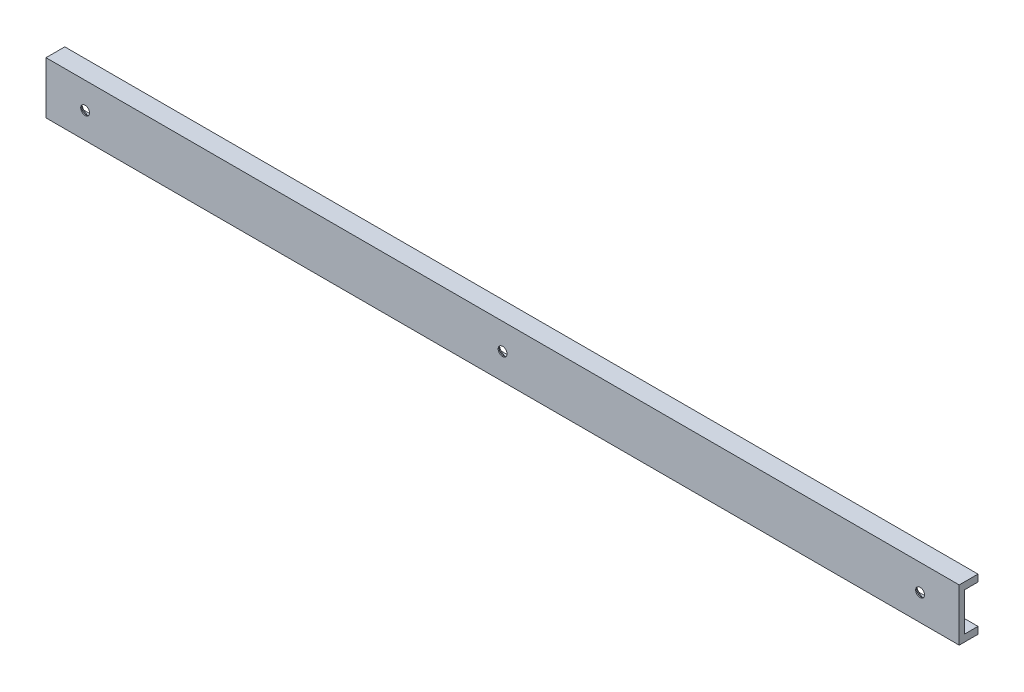
ISO-10303-21;
HEADER;
FILE_DESCRIPTION(('STEP AP214'),'2;1');
FILE_NAME('part.step','',(''),(''),'','','');
FILE_SCHEMA(('AUTOMOTIVE_DESIGN { 1 0 10303 214 1 1 1 1 }'));
ENDSEC;
DATA;
#1=APPLICATION_CONTEXT('core data for automotive mechanical design processes');
#2=APPLICATION_PROTOCOL_DEFINITION('international standard','automotive_design',2000,#1);
#3=PRODUCT_CONTEXT('',#1,'mechanical');
#4=PRODUCT('Part','Part','',(#3));
#5=PRODUCT_RELATED_PRODUCT_CATEGORY('part','',(#4));
#6=PRODUCT_DEFINITION_FORMATION('','',#4);
#7=PRODUCT_DEFINITION_CONTEXT('part definition',#1,'design');
#8=PRODUCT_DEFINITION('design','',#6,#7);
#9=PRODUCT_DEFINITION_SHAPE('','',#8);
#10=(LENGTH_UNIT() NAMED_UNIT(*) SI_UNIT(.MILLI.,.METRE.));
#11=(NAMED_UNIT(*) PLANE_ANGLE_UNIT() SI_UNIT($,.RADIAN.));
#12=(NAMED_UNIT(*) SI_UNIT($,.STERADIAN.) SOLID_ANGLE_UNIT());
#13=UNCERTAINTY_MEASURE_WITH_UNIT(LENGTH_MEASURE(1.E-05),#10,'distance_accuracy_value','');
#14=(GEOMETRIC_REPRESENTATION_CONTEXT(3) GLOBAL_UNCERTAINTY_ASSIGNED_CONTEXT((#13)) GLOBAL_UNIT_ASSIGNED_CONTEXT((#10,
#11,#12)) REPRESENTATION_CONTEXT('',''));
#15=CARTESIAN_POINT('',(0.,0.,0.));
#16=DIRECTION('',(0.,0.,1.));
#17=DIRECTION('',(1.,0.,0.));
#18=AXIS2_PLACEMENT_3D('',#15,#16,#17);
#19=CARTESIAN_POINT('',(-160.,0.,-2.));
#20=DIRECTION('',(0.,0.,-1.));
#21=DIRECTION('',(-1.,0.,0.));
#22=AXIS2_PLACEMENT_3D('',#19,#20,#21);
#23=CONICAL_SURFACE('',#22,3.3,0.785398163397445);
#24=CARTESIAN_POINT('',(-160.,0.,-0.400000000000001));
#25=DIRECTION('',(0.,0.,-1.));
#26=DIRECTION('',(-1.,0.,0.));
#27=AXIS2_PLACEMENT_3D('',#24,#25,#26);
#28=CIRCLE('',#27,1.70000000000001);
#29=CARTESIAN_POINT('',(-161.7,0.,-0.400000000000001));
#30=VERTEX_POINT('',#29);
#31=EDGE_CURVE('E11',#30,#30,#28,.T.);
#32=ORIENTED_EDGE('',*,*,#31,.F.);
#33=EDGE_LOOP('',(#32));
#34=FACE_BOUND('',#33,.T.);
#35=CARTESIAN_POINT('',(-160.,0.,-2.));
#36=DIRECTION('',(0.,0.,-1.));
#37=DIRECTION('',(-1.,0.,0.));
#38=AXIS2_PLACEMENT_3D('',#35,#36,#37);
#39=CIRCLE('',#38,3.3);
#40=CARTESIAN_POINT('',(-163.3,0.,-2.));
#41=VERTEX_POINT('',#40);
#42=EDGE_CURVE('E163',#41,#41,#39,.T.);
#43=ORIENTED_EDGE('',*,*,#42,.T.);
#44=EDGE_LOOP('',(#43));
#45=FACE_BOUND('',#44,.T.);
#46=ADVANCED_FACE('F35',(#34,#45),#23,.F.);
#47=CARTESIAN_POINT('',(-160.,0.,-2.));
#48=DIRECTION('',(0.,0.,-1.));
#49=DIRECTION('',(-1.,0.,0.));
#50=AXIS2_PLACEMENT_3D('',#47,#48,#49);
#51=CYLINDRICAL_SURFACE('',#50,1.70000000000001);
#52=CARTESIAN_POINT('',(-160.,0.,0.));
#53=DIRECTION('',(0.,0.,-1.));
#54=DIRECTION('',(-1.,0.,0.));
#55=AXIS2_PLACEMENT_3D('',#52,#53,#54);
#56=CIRCLE('',#55,1.70000000000001);
#57=CARTESIAN_POINT('',(-161.7,0.,0.));
#58=VERTEX_POINT('',#57);
#59=EDGE_CURVE('E43',#58,#58,#56,.T.);
#60=ORIENTED_EDGE('',*,*,#59,.F.);
#61=EDGE_LOOP('',(#60));
#62=FACE_BOUND('',#61,.T.);
#63=ORIENTED_EDGE('',*,*,#31,.T.);
#64=EDGE_LOOP('',(#63));
#65=FACE_BOUND('',#64,.T.);
#66=ADVANCED_FACE('F170',(#62,#65),#51,.F.);
#67=CARTESIAN_POINT('',(175.,10.,0.));
#68=DIRECTION('',(0.,-1.,0.));
#69=DIRECTION('',(0.,0.,-1.));
#70=AXIS2_PLACEMENT_3D('',#67,#68,#69);
#71=PLANE('',#70);
#72=DIRECTION('',(0.,0.,1.));
#73=VECTOR('',#72,1.);
#74=CARTESIAN_POINT('',(-175.,10.,0.));
#75=LINE('',#74,#73);
#76=CARTESIAN_POINT('',(-175.,10.,-7.2));
#77=VERTEX_POINT('',#76);
#78=CARTESIAN_POINT('',(-175.,10.,0.));
#79=VERTEX_POINT('',#78);
#80=EDGE_CURVE('E133',#77,#79,#75,.T.);
#81=ORIENTED_EDGE('',*,*,#80,.T.);
#82=DIRECTION('',(-1.,0.,0.));
#83=VECTOR('',#82,1.);
#84=CARTESIAN_POINT('',(175.,10.,0.));
#85=LINE('',#84,#83);
#86=CARTESIAN_POINT('',(175.,10.,0.));
#87=VERTEX_POINT('',#86);
#88=EDGE_CURVE('E161',#87,#79,#85,.T.);
#89=ORIENTED_EDGE('',*,*,#88,.F.);
#90=DIRECTION('',(0.,0.,1.));
#91=VECTOR('',#90,1.);
#92=CARTESIAN_POINT('',(175.,10.,0.));
#93=LINE('',#92,#91);
#94=CARTESIAN_POINT('',(175.,10.,-7.2));
#95=VERTEX_POINT('',#94);
#96=EDGE_CURVE('E148',#95,#87,#93,.T.);
#97=ORIENTED_EDGE('',*,*,#96,.F.);
#98=DIRECTION('',(-1.,0.,0.));
#99=VECTOR('',#98,1.);
#100=CARTESIAN_POINT('',(175.,10.,-7.2));
#101=LINE('',#100,#99);
#102=EDGE_CURVE('E129',#95,#77,#101,.T.);
#103=ORIENTED_EDGE('',*,*,#102,.T.);
#104=EDGE_LOOP('',(#81,#89,#97,#103));
#105=FACE_BOUND('',#104,.T.);
#106=ADVANCED_FACE('F173',(#105),#71,.F.);
#107=CARTESIAN_POINT('',(175.,-10.,0.));
#108=DIRECTION('',(0.,0.,-1.));
#109=DIRECTION('',(-1.,0.,0.));
#110=AXIS2_PLACEMENT_3D('',#107,#108,#109);
#111=PLANE('',#110);
#112=CARTESIAN_POINT('',(0.,0.,0.));
#113=DIRECTION('',(0.,0.,-1.));
#114=DIRECTION('',(-1.,0.,0.));
#115=AXIS2_PLACEMENT_3D('',#112,#113,#114);
#116=CIRCLE('',#115,1.70000000000001);
#117=CARTESIAN_POINT('',(-1.70000000000003,0.,0.));
#118=VERTEX_POINT('',#117);
#119=EDGE_CURVE('E238',#118,#118,#116,.T.);
#120=ORIENTED_EDGE('',*,*,#119,.T.);
#121=EDGE_LOOP('',(#120));
#122=FACE_BOUND('',#121,.T.);
#123=CARTESIAN_POINT('',(160.,0.,0.));
#124=DIRECTION('',(0.,0.,-1.));
#125=DIRECTION('',(-1.,0.,0.));
#126=AXIS2_PLACEMENT_3D('',#123,#124,#125);
#127=CIRCLE('',#126,1.70000000000001);
#128=CARTESIAN_POINT('',(158.3,0.,0.));
#129=VERTEX_POINT('',#128);
#130=EDGE_CURVE('E137',#129,#129,#127,.T.);
#131=ORIENTED_EDGE('',*,*,#130,.T.);
#132=EDGE_LOOP('',(#131));
#133=FACE_BOUND('',#132,.T.);
#134=DIRECTION('',(0.,-1.,0.));
#135=VECTOR('',#134,1.);
#136=CARTESIAN_POINT('',(-175.,-10.,0.));
#137=LINE('',#136,#135);
#138=CARTESIAN_POINT('',(-175.,-10.,0.));
#139=VERTEX_POINT('',#138);
#140=EDGE_CURVE('E136',#79,#139,#137,.T.);
#141=ORIENTED_EDGE('',*,*,#140,.T.);
#142=DIRECTION('',(-1.,0.,0.));
#143=VECTOR('',#142,1.);
#144=CARTESIAN_POINT('',(175.,-10.,0.));
#145=LINE('',#144,#143);
#146=CARTESIAN_POINT('',(175.,-10.,0.));
#147=VERTEX_POINT('',#146);
#148=EDGE_CURVE('E158',#147,#139,#145,.T.);
#149=ORIENTED_EDGE('',*,*,#148,.F.);
#150=DIRECTION('',(0.,-1.,0.));
#151=VECTOR('',#150,1.);
#152=CARTESIAN_POINT('',(175.,-10.,0.));
#153=LINE('',#152,#151);
#154=EDGE_CURVE('E95',#87,#147,#153,.T.);
#155=ORIENTED_EDGE('',*,*,#154,.F.);
#156=ORIENTED_EDGE('',*,*,#88,.T.);
#157=EDGE_LOOP('',(#141,#149,#155,#156));
#158=FACE_BOUND('',#157,.T.);
#159=ORIENTED_EDGE('',*,*,#59,.T.);
#160=EDGE_LOOP('',(#159));
#161=FACE_BOUND('',#160,.T.);
#162=ADVANCED_FACE('F168',(#122,#133,#158,#161),#111,.F.);
#163=CARTESIAN_POINT('',(175.,-10.,-7.2));
#164=DIRECTION('',(0.,1.,0.));
#165=DIRECTION('',(0.,0.,1.));
#166=AXIS2_PLACEMENT_3D('',#163,#164,#165);
#167=PLANE('',#166);
#168=DIRECTION('',(0.,0.,-1.));
#169=VECTOR('',#168,1.);
#170=CARTESIAN_POINT('',(-175.,-10.,-7.2));
#171=LINE('',#170,#169);
#172=CARTESIAN_POINT('',(-175.,-10.,-7.2));
#173=VERTEX_POINT('',#172);
#174=EDGE_CURVE('E139',#139,#173,#171,.T.);
#175=ORIENTED_EDGE('',*,*,#174,.T.);
#176=DIRECTION('',(-1.,0.,0.));
#177=VECTOR('',#176,1.);
#178=CARTESIAN_POINT('',(175.,-10.,-7.2));
#179=LINE('',#178,#177);
#180=CARTESIAN_POINT('',(175.,-10.,-7.2));
#181=VERTEX_POINT('',#180);
#182=EDGE_CURVE('E155',#181,#173,#179,.T.);
#183=ORIENTED_EDGE('',*,*,#182,.F.);
#184=DIRECTION('',(0.,0.,-1.));
#185=VECTOR('',#184,1.);
#186=CARTESIAN_POINT('',(175.,-10.,-7.2));
#187=LINE('',#186,#185);
#188=EDGE_CURVE('E219',#147,#181,#187,.T.);
#189=ORIENTED_EDGE('',*,*,#188,.F.);
#190=ORIENTED_EDGE('',*,*,#148,.T.);
#191=EDGE_LOOP('',(#175,#183,#189,#190));
#192=FACE_BOUND('',#191,.T.);
#193=ADVANCED_FACE('F198',(#192),#167,.F.);
#194=CARTESIAN_POINT('',(175.,-7.35,-7.2));
#195=DIRECTION('',(0.,0.,1.));
#196=DIRECTION('',(1.,0.,0.));
#197=AXIS2_PLACEMENT_3D('',#194,#195,#196);
#198=PLANE('',#197);
#199=DIRECTION('',(0.,1.,0.));
#200=VECTOR('',#199,1.);
#201=CARTESIAN_POINT('',(-175.,-7.35,-7.2));
#202=LINE('',#201,#200);
#203=CARTESIAN_POINT('',(-175.,-7.35,-7.2));
#204=VERTEX_POINT('',#203);
#205=EDGE_CURVE('E141',#173,#204,#202,.T.);
#206=ORIENTED_EDGE('',*,*,#205,.T.);
#207=DIRECTION('',(-1.,0.,0.));
#208=VECTOR('',#207,1.);
#209=CARTESIAN_POINT('',(175.,-7.35,-7.2));
#210=LINE('',#209,#208);
#211=CARTESIAN_POINT('',(175.,-7.35,-7.2));
#212=VERTEX_POINT('',#211);
#213=EDGE_CURVE('E152',#212,#204,#210,.T.);
#214=ORIENTED_EDGE('',*,*,#213,.F.);
#215=DIRECTION('',(0.,1.,0.));
#216=VECTOR('',#215,1.);
#217=CARTESIAN_POINT('',(175.,-7.35,-7.2));
#218=LINE('',#217,#216);
#219=EDGE_CURVE('E221',#181,#212,#218,.T.);
#220=ORIENTED_EDGE('',*,*,#219,.F.);
#221=ORIENTED_EDGE('',*,*,#182,.T.);
#222=EDGE_LOOP('',(#206,#214,#220,#221));
#223=FACE_BOUND('',#222,.T.);
#224=ADVANCED_FACE('F189',(#223),#198,.F.);
#225=CARTESIAN_POINT('',(175.,-7.35,-2.));
#226=DIRECTION('',(0.,-1.,0.));
#227=DIRECTION('',(0.,0.,-1.));
#228=AXIS2_PLACEMENT_3D('',#225,#226,#227);
#229=PLANE('',#228);
#230=DIRECTION('',(0.,0.,1.));
#231=VECTOR('',#230,1.);
#232=CARTESIAN_POINT('',(-175.,-7.35,-2.));
#233=LINE('',#232,#231);
#234=CARTESIAN_POINT('',(-175.,-7.35,-2.));
#235=VERTEX_POINT('',#234);
#236=EDGE_CURVE('E143',#204,#235,#233,.T.);
#237=ORIENTED_EDGE('',*,*,#236,.T.);
#238=DIRECTION('',(-1.,0.,0.));
#239=VECTOR('',#238,1.);
#240=CARTESIAN_POINT('',(175.,-7.35,-2.));
#241=LINE('',#240,#239);
#242=CARTESIAN_POINT('',(175.,-7.35,-2.));
#243=VERTEX_POINT('',#242);
#244=EDGE_CURVE('E124',#243,#235,#241,.T.);
#245=ORIENTED_EDGE('',*,*,#244,.F.);
#246=DIRECTION('',(0.,0.,1.));
#247=VECTOR('',#246,1.);
#248=CARTESIAN_POINT('',(175.,-7.35,-2.));
#249=LINE('',#248,#247);
#250=EDGE_CURVE('E114',#212,#243,#249,.T.);
#251=ORIENTED_EDGE('',*,*,#250,.F.);
#252=ORIENTED_EDGE('',*,*,#213,.T.);
#253=EDGE_LOOP('',(#237,#245,#251,#252));
#254=FACE_BOUND('',#253,.T.);
#255=ADVANCED_FACE('F180',(#254),#229,.F.);
#256=CARTESIAN_POINT('',(175.,7.35,-2.));
#257=DIRECTION('',(0.,0.,1.));
#258=DIRECTION('',(1.,0.,0.));
#259=AXIS2_PLACEMENT_3D('',#256,#257,#258);
#260=PLANE('',#259);
#261=CARTESIAN_POINT('',(0.,0.,-2.));
#262=DIRECTION('',(0.,0.,-1.));
#263=DIRECTION('',(-1.,0.,0.));
#264=AXIS2_PLACEMENT_3D('',#261,#262,#263);
#265=CIRCLE('',#264,3.3);
#266=CARTESIAN_POINT('',(-3.30000000000003,0.,-2.));
#267=VERTEX_POINT('',#266);
#268=EDGE_CURVE('E241',#267,#267,#265,.T.);
#269=ORIENTED_EDGE('',*,*,#268,.F.);
#270=EDGE_LOOP('',(#269));
#271=FACE_BOUND('',#270,.T.);
#272=CARTESIAN_POINT('',(160.,0.,-2.));
#273=DIRECTION('',(0.,0.,-1.));
#274=DIRECTION('',(-1.,0.,0.));
#275=AXIS2_PLACEMENT_3D('',#272,#273,#274);
#276=CIRCLE('',#275,3.3);
#277=CARTESIAN_POINT('',(156.7,0.,-2.));
#278=VERTEX_POINT('',#277);
#279=EDGE_CURVE('E232',#278,#278,#276,.T.);
#280=ORIENTED_EDGE('',*,*,#279,.F.);
#281=EDGE_LOOP('',(#280));
#282=FACE_BOUND('',#281,.T.);
#283=DIRECTION('',(0.,1.,0.));
#284=VECTOR('',#283,1.);
#285=CARTESIAN_POINT('',(-175.,7.35,-2.));
#286=LINE('',#285,#284);
#287=CARTESIAN_POINT('',(-175.,7.35,-2.));
#288=VERTEX_POINT('',#287);
#289=EDGE_CURVE('E123',#235,#288,#286,.T.);
#290=ORIENTED_EDGE('',*,*,#289,.T.);
#291=DIRECTION('',(-1.,0.,0.));
#292=VECTOR('',#291,1.);
#293=CARTESIAN_POINT('',(175.,7.35,-2.));
#294=LINE('',#293,#292);
#295=CARTESIAN_POINT('',(175.,7.35,-2.));
#296=VERTEX_POINT('',#295);
#297=EDGE_CURVE('E119',#296,#288,#294,.T.);
#298=ORIENTED_EDGE('',*,*,#297,.F.);
#299=DIRECTION('',(0.,1.,0.));
#300=VECTOR('',#299,1.);
#301=CARTESIAN_POINT('',(175.,7.35,-2.));
#302=LINE('',#301,#300);
#303=EDGE_CURVE('E108',#243,#296,#302,.T.);
#304=ORIENTED_EDGE('',*,*,#303,.F.);
#305=ORIENTED_EDGE('',*,*,#244,.T.);
#306=EDGE_LOOP('',(#290,#298,#304,#305));
#307=FACE_BOUND('',#306,.T.);
#308=ORIENTED_EDGE('',*,*,#42,.F.);
#309=EDGE_LOOP('',(#308));
#310=FACE_BOUND('',#309,.T.);
#311=ADVANCED_FACE('F120',(#271,#282,#307,#310),#260,.F.);
#312=CARTESIAN_POINT('',(175.,7.35,-7.2));
#313=DIRECTION('',(0.,1.,0.));
#314=DIRECTION('',(0.,0.,1.));
#315=AXIS2_PLACEMENT_3D('',#312,#313,#314);
#316=PLANE('',#315);
#317=DIRECTION('',(0.,0.,-1.));
#318=VECTOR('',#317,1.);
#319=CARTESIAN_POINT('',(-175.,7.35,-7.2));
#320=LINE('',#319,#318);
#321=CARTESIAN_POINT('',(-175.,7.35,-7.2));
#322=VERTEX_POINT('',#321);
#323=EDGE_CURVE('E80',#288,#322,#320,.T.);
#324=ORIENTED_EDGE('',*,*,#323,.T.);
#325=DIRECTION('',(-1.,0.,0.));
#326=VECTOR('',#325,1.);
#327=CARTESIAN_POINT('',(175.,7.35,-7.2));
#328=LINE('',#327,#326);
#329=CARTESIAN_POINT('',(175.,7.35,-7.2));
#330=VERTEX_POINT('',#329);
#331=EDGE_CURVE('E125',#330,#322,#328,.T.);
#332=ORIENTED_EDGE('',*,*,#331,.F.);
#333=DIRECTION('',(0.,0.,-1.));
#334=VECTOR('',#333,1.);
#335=CARTESIAN_POINT('',(175.,7.35,-7.2));
#336=LINE('',#335,#334);
#337=EDGE_CURVE('E112',#296,#330,#336,.T.);
#338=ORIENTED_EDGE('',*,*,#337,.F.);
#339=ORIENTED_EDGE('',*,*,#297,.T.);
#340=EDGE_LOOP('',(#324,#332,#338,#339));
#341=FACE_BOUND('',#340,.T.);
#342=ADVANCED_FACE('F127',(#341),#316,.F.);
#343=CARTESIAN_POINT('',(175.,10.,-7.2));
#344=DIRECTION('',(0.,0.,1.));
#345=DIRECTION('',(1.,0.,0.));
#346=AXIS2_PLACEMENT_3D('',#343,#344,#345);
#347=PLANE('',#346);
#348=DIRECTION('',(0.,1.,0.));
#349=VECTOR('',#348,1.);
#350=CARTESIAN_POINT('',(-175.,10.,-7.2));
#351=LINE('',#350,#349);
#352=EDGE_CURVE('E86',#322,#77,#351,.T.);
#353=ORIENTED_EDGE('',*,*,#352,.T.);
#354=ORIENTED_EDGE('',*,*,#102,.F.);
#355=DIRECTION('',(0.,1.,0.));
#356=VECTOR('',#355,1.);
#357=CARTESIAN_POINT('',(175.,10.,-7.2));
#358=LINE('',#357,#356);
#359=EDGE_CURVE('E51',#330,#95,#358,.T.);
#360=ORIENTED_EDGE('',*,*,#359,.F.);
#361=ORIENTED_EDGE('',*,*,#331,.T.);
#362=EDGE_LOOP('',(#353,#354,#360,#361));
#363=FACE_BOUND('',#362,.T.);
#364=ADVANCED_FACE('F187',(#363),#347,.F.);
#365=CARTESIAN_POINT('',(175.,0.,0.));
#366=DIRECTION('',(-1.,0.,0.));
#367=DIRECTION('',(0.,0.,1.));
#368=AXIS2_PLACEMENT_3D('',#365,#366,#367);
#369=PLANE('',#368);
#370=ORIENTED_EDGE('',*,*,#96,.T.);
#371=ORIENTED_EDGE('',*,*,#154,.T.);
#372=ORIENTED_EDGE('',*,*,#188,.T.);
#373=ORIENTED_EDGE('',*,*,#219,.T.);
#374=ORIENTED_EDGE('',*,*,#250,.T.);
#375=ORIENTED_EDGE('',*,*,#303,.T.);
#376=ORIENTED_EDGE('',*,*,#337,.T.);
#377=ORIENTED_EDGE('',*,*,#359,.T.);
#378=EDGE_LOOP('',(#370,#371,#372,#373,#374,#375,#376,#377));
#379=FACE_BOUND('',#378,.T.);
#380=ADVANCED_FACE('F110',(#379),#369,.F.);
#381=CARTESIAN_POINT('',(-175.,0.,0.));
#382=DIRECTION('',(-1.,0.,0.));
#383=DIRECTION('',(0.,0.,1.));
#384=AXIS2_PLACEMENT_3D('',#381,#382,#383);
#385=PLANE('',#384);
#386=ORIENTED_EDGE('',*,*,#80,.F.);
#387=ORIENTED_EDGE('',*,*,#352,.F.);
#388=ORIENTED_EDGE('',*,*,#323,.F.);
#389=ORIENTED_EDGE('',*,*,#289,.F.);
#390=ORIENTED_EDGE('',*,*,#236,.F.);
#391=ORIENTED_EDGE('',*,*,#205,.F.);
#392=ORIENTED_EDGE('',*,*,#174,.F.);
#393=ORIENTED_EDGE('',*,*,#140,.F.);
#394=EDGE_LOOP('',(#386,#387,#388,#389,#390,#391,#392,#393));
#395=FACE_BOUND('',#394,.T.);
#396=ADVANCED_FACE('F214',(#395),#385,.T.);
#397=CARTESIAN_POINT('',(160.,0.,-2.));
#398=DIRECTION('',(0.,0.,-1.));
#399=DIRECTION('',(-1.,0.,0.));
#400=AXIS2_PLACEMENT_3D('',#397,#398,#399);
#401=CYLINDRICAL_SURFACE('',#400,1.70000000000001);
#402=ORIENTED_EDGE('',*,*,#130,.F.);
#403=EDGE_LOOP('',(#402));
#404=FACE_BOUND('',#403,.T.);
#405=CARTESIAN_POINT('',(160.,0.,-0.400000000000001));
#406=DIRECTION('',(0.,0.,-1.));
#407=DIRECTION('',(-1.,0.,0.));
#408=AXIS2_PLACEMENT_3D('',#405,#406,#407);
#409=CIRCLE('',#408,1.70000000000001);
#410=CARTESIAN_POINT('',(158.3,0.,-0.400000000000001));
#411=VERTEX_POINT('',#410);
#412=EDGE_CURVE('E229',#411,#411,#409,.T.);
#413=ORIENTED_EDGE('',*,*,#412,.T.);
#414=EDGE_LOOP('',(#413));
#415=FACE_BOUND('',#414,.T.);
#416=ADVANCED_FACE('F259',(#404,#415),#401,.F.);
#417=CARTESIAN_POINT('',(160.,0.,-2.));
#418=DIRECTION('',(0.,0.,-1.));
#419=DIRECTION('',(-1.,0.,0.));
#420=AXIS2_PLACEMENT_3D('',#417,#418,#419);
#421=CONICAL_SURFACE('',#420,3.3,0.785398163397445);
#422=ORIENTED_EDGE('',*,*,#412,.F.);
#423=EDGE_LOOP('',(#422));
#424=FACE_BOUND('',#423,.T.);
#425=ORIENTED_EDGE('',*,*,#279,.T.);
#426=EDGE_LOOP('',(#425));
#427=FACE_BOUND('',#426,.T.);
#428=ADVANCED_FACE('F252',(#424,#427),#421,.F.);
#429=CARTESIAN_POINT('',(0.,0.,-2.));
#430=DIRECTION('',(0.,0.,-1.));
#431=DIRECTION('',(-1.,0.,0.));
#432=AXIS2_PLACEMENT_3D('',#429,#430,#431);
#433=CYLINDRICAL_SURFACE('',#432,1.70000000000001);
#434=ORIENTED_EDGE('',*,*,#119,.F.);
#435=EDGE_LOOP('',(#434));
#436=FACE_BOUND('',#435,.T.);
#437=CARTESIAN_POINT('',(0.,0.,-0.400000000000001));
#438=DIRECTION('',(0.,0.,-1.));
#439=DIRECTION('',(-1.,0.,0.));
#440=AXIS2_PLACEMENT_3D('',#437,#438,#439);
#441=CIRCLE('',#440,1.70000000000001);
#442=CARTESIAN_POINT('',(-1.70000000000003,0.,-0.400000000000001));
#443=VERTEX_POINT('',#442);
#444=EDGE_CURVE('E235',#443,#443,#441,.T.);
#445=ORIENTED_EDGE('',*,*,#444,.T.);
#446=EDGE_LOOP('',(#445));
#447=FACE_BOUND('',#446,.T.);
#448=ADVANCED_FACE('F246',(#436,#447),#433,.F.);
#449=CARTESIAN_POINT('',(0.,0.,-2.));
#450=DIRECTION('',(0.,0.,-1.));
#451=DIRECTION('',(-1.,0.,0.));
#452=AXIS2_PLACEMENT_3D('',#449,#450,#451);
#453=CONICAL_SURFACE('',#452,3.3,0.785398163397445);
#454=ORIENTED_EDGE('',*,*,#444,.F.);
#455=EDGE_LOOP('',(#454));
#456=FACE_BOUND('',#455,.T.);
#457=ORIENTED_EDGE('',*,*,#268,.T.);
#458=EDGE_LOOP('',(#457));
#459=FACE_BOUND('',#458,.T.);
#460=ADVANCED_FACE('F244',(#456,#459),#453,.F.);
#461=CLOSED_SHELL('',(#46,#66,#106,#162,#193,#224,#255,#311,#342,#364,#380,#396,#416,#428,#448,#460));
#462=MANIFOLD_SOLID_BREP('B2',#461);
#463=ADVANCED_BREP_SHAPE_REPRESENTATION('',(#18,#462),#14);
#464=SHAPE_DEFINITION_REPRESENTATION(#9,#463);
ENDSEC;
END-ISO-10303-21;
